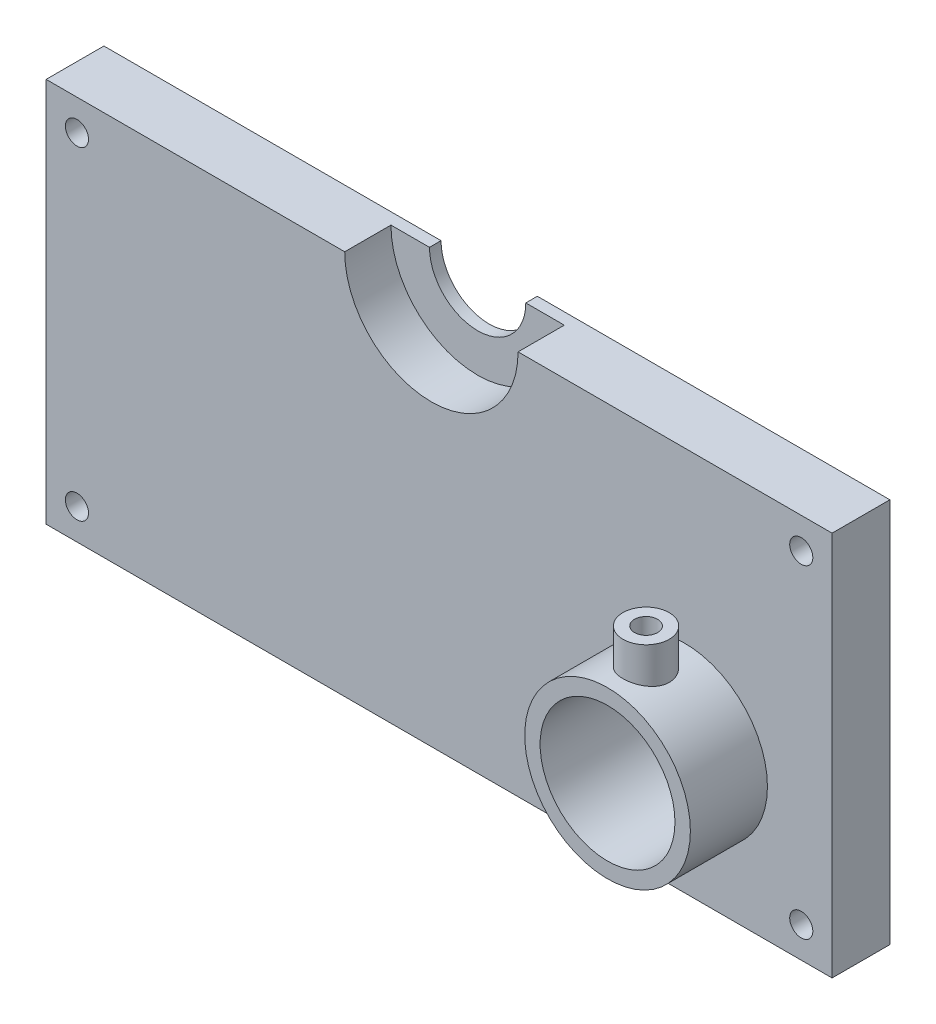
ISO-10303-21;
HEADER;
FILE_DESCRIPTION(('STEP AP214'),'2;1');
FILE_NAME('part.step','',(''),(''),'','','');
FILE_SCHEMA(('AUTOMOTIVE_DESIGN { 1 0 10303 214 1 1 1 1 }'));
ENDSEC;
DATA;
#1=APPLICATION_CONTEXT('core data for automotive mechanical design processes');
#2=APPLICATION_PROTOCOL_DEFINITION('international standard','automotive_design',2000,#1);
#3=PRODUCT_CONTEXT('',#1,'mechanical');
#4=PRODUCT('Part','Part','',(#3));
#5=PRODUCT_RELATED_PRODUCT_CATEGORY('part','',(#4));
#6=PRODUCT_DEFINITION_FORMATION('','',#4);
#7=PRODUCT_DEFINITION_CONTEXT('part definition',#1,'design');
#8=PRODUCT_DEFINITION('design','',#6,#7);
#9=PRODUCT_DEFINITION_SHAPE('','',#8);
#10=(LENGTH_UNIT() NAMED_UNIT(*) SI_UNIT(.MILLI.,.METRE.));
#11=(NAMED_UNIT(*) PLANE_ANGLE_UNIT() SI_UNIT($,.RADIAN.));
#12=(NAMED_UNIT(*) SI_UNIT($,.STERADIAN.) SOLID_ANGLE_UNIT());
#13=UNCERTAINTY_MEASURE_WITH_UNIT(LENGTH_MEASURE(1.E-05),#10,'distance_accuracy_value','');
#14=(GEOMETRIC_REPRESENTATION_CONTEXT(3) GLOBAL_UNCERTAINTY_ASSIGNED_CONTEXT((#13)) GLOBAL_UNIT_ASSIGNED_CONTEXT((#10,
#11,#12)) REPRESENTATION_CONTEXT('',''));
#15=CARTESIAN_POINT('',(0.,0.,0.));
#16=DIRECTION('',(0.,0.,1.));
#17=DIRECTION('',(1.,0.,0.));
#18=AXIS2_PLACEMENT_3D('',#15,#16,#17);
#19=CARTESIAN_POINT('',(-46.,-4.,115.5));
#20=DIRECTION('',(0.,0.,-1.));
#21=DIRECTION('',(-1.,0.,0.));
#22=AXIS2_PLACEMENT_3D('',#19,#20,#21);
#23=CYLINDRICAL_SURFACE('',#22,1.5);
#24=CARTESIAN_POINT('',(-46.,-4.,113.));
#25=DIRECTION('',(0.,0.,1.));
#26=DIRECTION('',(1.,0.,0.));
#27=AXIS2_PLACEMENT_3D('',#24,#25,#26);
#28=CIRCLE('',#27,1.5);
#29=CARTESIAN_POINT('',(-44.5,-4.,113.));
#30=VERTEX_POINT('',#29);
#31=EDGE_CURVE('E538',#30,#30,#28,.T.);
#32=ORIENTED_EDGE('',*,*,#31,.T.);
#33=EDGE_LOOP('',(#32));
#34=FACE_BOUND('',#33,.T.);
#35=CARTESIAN_POINT('',(-46.,-4.,107.5));
#36=DIRECTION('',(0.,0.,-1.));
#37=DIRECTION('',(-1.,0.,0.));
#38=AXIS2_PLACEMENT_3D('',#35,#36,#37);
#39=CIRCLE('',#38,1.5);
#40=CARTESIAN_POINT('',(-47.5,-4.,107.5));
#41=VERTEX_POINT('',#40);
#42=EDGE_CURVE('E39',#41,#41,#39,.F.);
#43=ORIENTED_EDGE('',*,*,#42,.F.);
#44=EDGE_LOOP('',(#43));
#45=FACE_BOUND('',#44,.T.);
#46=ADVANCED_FACE('F35',(#34,#45),#23,.F.);
#47=CARTESIAN_POINT('',(-46.,-46.,115.5));
#48=DIRECTION('',(0.,0.,-1.));
#49=DIRECTION('',(-1.,0.,0.));
#50=AXIS2_PLACEMENT_3D('',#47,#48,#49);
#51=CYLINDRICAL_SURFACE('',#50,1.5);
#52=CARTESIAN_POINT('',(-46.,-46.,113.));
#53=DIRECTION('',(0.,0.,1.));
#54=DIRECTION('',(1.,0.,0.));
#55=AXIS2_PLACEMENT_3D('',#52,#53,#54);
#56=CIRCLE('',#55,1.5);
#57=CARTESIAN_POINT('',(-44.5,-46.,113.));
#58=VERTEX_POINT('',#57);
#59=EDGE_CURVE('E299',#58,#58,#56,.T.);
#60=ORIENTED_EDGE('',*,*,#59,.T.);
#61=EDGE_LOOP('',(#60));
#62=FACE_BOUND('',#61,.T.);
#63=CARTESIAN_POINT('',(-46.,-46.,107.5));
#64=DIRECTION('',(0.,0.,-1.));
#65=DIRECTION('',(-1.,0.,0.));
#66=AXIS2_PLACEMENT_3D('',#63,#64,#65);
#67=CIRCLE('',#66,1.5);
#68=CARTESIAN_POINT('',(-47.5,-46.,107.5));
#69=VERTEX_POINT('',#68);
#70=EDGE_CURVE('E553',#69,#69,#67,.F.);
#71=ORIENTED_EDGE('',*,*,#70,.F.);
#72=EDGE_LOOP('',(#71));
#73=FACE_BOUND('',#72,.T.);
#74=ADVANCED_FACE('F250',(#62,#73),#51,.F.);
#75=CARTESIAN_POINT('',(48.,-46.,115.5));
#76=DIRECTION('',(0.,0.,-1.));
#77=DIRECTION('',(-1.,0.,0.));
#78=AXIS2_PLACEMENT_3D('',#75,#76,#77);
#79=CYLINDRICAL_SURFACE('',#78,1.5);
#80=CARTESIAN_POINT('',(48.,-46.,113.));
#81=DIRECTION('',(0.,0.,1.));
#82=DIRECTION('',(1.,0.,0.));
#83=AXIS2_PLACEMENT_3D('',#80,#81,#82);
#84=CIRCLE('',#83,1.5);
#85=CARTESIAN_POINT('',(49.5,-46.,113.));
#86=VERTEX_POINT('',#85);
#87=EDGE_CURVE('E542',#86,#86,#84,.T.);
#88=ORIENTED_EDGE('',*,*,#87,.T.);
#89=EDGE_LOOP('',(#88));
#90=FACE_BOUND('',#89,.T.);
#91=CARTESIAN_POINT('',(48.,-46.,107.5));
#92=DIRECTION('',(0.,0.,-1.));
#93=DIRECTION('',(-1.,0.,0.));
#94=AXIS2_PLACEMENT_3D('',#91,#92,#93);
#95=CIRCLE('',#94,1.5);
#96=CARTESIAN_POINT('',(46.5,-46.,107.5));
#97=VERTEX_POINT('',#96);
#98=EDGE_CURVE('E546',#97,#97,#95,.F.);
#99=ORIENTED_EDGE('',*,*,#98,.F.);
#100=EDGE_LOOP('',(#99));
#101=FACE_BOUND('',#100,.T.);
#102=ADVANCED_FACE('F257',(#90,#101),#79,.F.);
#103=CARTESIAN_POINT('',(48.,-4.,117.242640687119));
#104=DIRECTION('',(0.,0.,-1.));
#105=DIRECTION('',(-1.,0.,0.));
#106=AXIS2_PLACEMENT_3D('',#103,#104,#105);
#107=CYLINDRICAL_SURFACE('',#106,1.5);
#108=CARTESIAN_POINT('',(48.,-4.,113.));
#109=DIRECTION('',(0.,0.,1.));
#110=DIRECTION('',(1.,0.,0.));
#111=AXIS2_PLACEMENT_3D('',#108,#109,#110);
#112=CIRCLE('',#111,1.5);
#113=CARTESIAN_POINT('',(49.5,-4.,113.));
#114=VERTEX_POINT('',#113);
#115=EDGE_CURVE('E287',#114,#114,#112,.F.);
#116=ORIENTED_EDGE('',*,*,#115,.F.);
#117=EDGE_LOOP('',(#116));
#118=FACE_BOUND('',#117,.T.);
#119=CARTESIAN_POINT('',(48.,-4.,107.5));
#120=DIRECTION('',(0.,0.,-1.));
#121=DIRECTION('',(-1.,0.,0.));
#122=AXIS2_PLACEMENT_3D('',#119,#120,#121);
#123=CIRCLE('',#122,1.5);
#124=CARTESIAN_POINT('',(46.5,-4.,107.5));
#125=VERTEX_POINT('',#124);
#126=EDGE_CURVE('E186',#125,#125,#123,.F.);
#127=ORIENTED_EDGE('',*,*,#126,.F.);
#128=EDGE_LOOP('',(#127));
#129=FACE_BOUND('',#128,.T.);
#130=ADVANCED_FACE('F267',(#118,#129),#107,.F.);
#131=CARTESIAN_POINT('',(32.86,-32.68,123.));
#132=DIRECTION('',(0.,0.,-1.));
#133=DIRECTION('',(-1.,0.,0.));
#134=AXIS2_PLACEMENT_3D('',#131,#132,#133);
#135=CYLINDRICAL_SURFACE('',#134,10.75);
#136=CARTESIAN_POINT('',(32.86,-32.68,113.));
#137=DIRECTION('',(0.,0.,1.));
#138=DIRECTION('',(1.,0.,0.));
#139=AXIS2_PLACEMENT_3D('',#136,#137,#138);
#140=CIRCLE('',#139,10.75);
#141=CARTESIAN_POINT('',(43.61,-32.68,113.));
#142=VERTEX_POINT('',#141);
#143=EDGE_CURVE('E153',#142,#142,#140,.T.);
#144=ORIENTED_EDGE('',*,*,#143,.T.);
#145=EDGE_LOOP('',(#144));
#146=FACE_BOUND('',#145,.T.);
#147=CARTESIAN_POINT('',(32.86,-32.68,123.));
#148=DIRECTION('',(0.,0.,1.));
#149=DIRECTION('',(1.,0.,0.));
#150=AXIS2_PLACEMENT_3D('',#147,#148,#149);
#151=CIRCLE('',#150,10.75);
#152=CARTESIAN_POINT('',(43.61,-32.68,123.));
#153=VERTEX_POINT('',#152);
#154=EDGE_CURVE('E154',#153,#153,#151,.T.);
#155=ORIENTED_EDGE('',*,*,#154,.F.);
#156=EDGE_LOOP('',(#155));
#157=FACE_BOUND('',#156,.T.);
#158=CARTESIAN_POINT('',(32.86,-21.93,115.));
#159=CARTESIAN_POINT('',(32.6949077076346,-21.9300021699373,115.000003288464));
#160=CARTESIAN_POINT('',(32.5297811544795,-21.9338401379829,115.013673262241));
#161=CARTESIAN_POINT('',(32.2043036674773,-21.9487770769157,115.06788342221));
#162=CARTESIAN_POINT('',(32.0439547436764,-21.9598790600518,115.108434755682));
#163=CARTESIAN_POINT('',(31.7327762723217,-21.9881218354101,115.214972454814));
#164=CARTESIAN_POINT('',(31.5819341270789,-22.0052544291121,115.280924300282));
#165=CARTESIAN_POINT('',(31.2934504766978,-22.04375865675,115.436257962016));
#166=CARTESIAN_POINT('',(31.155810179185,-22.0651306779356,115.525641918924));
#167=CARTESIAN_POINT('',(30.8941700979436,-22.1104183025175,115.727678304179));
#168=CARTESIAN_POINT('',(30.7705501602774,-22.1343805755824,115.840812174128));
#169=CARTESIAN_POINT('',(30.5437684778834,-22.1818561737601,116.086108924169));
#170=CARTESIAN_POINT('',(30.4406096411602,-22.2053694346291,116.218274504516));
#171=CARTESIAN_POINT('',(30.2557742195686,-22.2497678486268,116.50098004966));
#172=CARTESIAN_POINT('',(30.1745441424239,-22.2705944262695,116.651821996239));
#173=CARTESIAN_POINT('',(30.0387517034795,-22.3065710848422,116.965698336376));
#174=CARTESIAN_POINT('',(29.9841838996154,-22.3217223240241,117.128730233991));
#175=CARTESIAN_POINT('',(29.9046023942352,-22.3441493559096,117.458129807144));
#176=CARTESIAN_POINT('',(29.8788957179174,-22.3516094413276,117.624317198873));
#177=CARTESIAN_POINT('',(29.8556043817253,-22.3583593011281,117.958800386303));
#178=CARTESIAN_POINT('',(29.858013920035,-22.357650761117,118.127095739863));
#179=CARTESIAN_POINT('',(29.8903385839298,-22.3483077982643,118.455529374855));
#180=CARTESIAN_POINT('',(29.9194048122015,-22.3399180032174,118.61575928713));
#181=CARTESIAN_POINT('',(30.0028538788318,-22.3165509991549,118.928972312695));
#182=CARTESIAN_POINT('',(30.0572389115411,-22.3015732191726,119.081954796591));
#183=CARTESIAN_POINT('',(30.190449258091,-22.2665100029562,119.378493787044));
#184=CARTESIAN_POINT('',(30.2695640809612,-22.2463645990934,119.521912849871));
#185=CARTESIAN_POINT('',(30.4497865778065,-22.2032670119221,119.793732814414));
#186=CARTESIAN_POINT('',(30.5508989483605,-22.1803142296842,119.922130499979));
#187=CARTESIAN_POINT('',(30.7765421898665,-22.1331791462612,120.165100878993));
#188=CARTESIAN_POINT('',(30.9017830143566,-22.1089822753319,120.279012425079));
#189=CARTESIAN_POINT('',(31.1698884810187,-22.062820559194,120.484358138123));
#190=CARTESIAN_POINT('',(31.3127539544975,-22.0408558193581,120.575791244223));
#191=CARTESIAN_POINT('',(31.6131406892037,-22.0014760261901,120.733914577847));
#192=CARTESIAN_POINT('',(31.770733360272,-21.9840848855177,120.800475496542));
#193=CARTESIAN_POINT('',(32.0954702101624,-21.9559842363693,120.905962867771));
#194=CARTESIAN_POINT('',(32.2626120856294,-21.9452731239753,120.944895954236));
#195=CARTESIAN_POINT('',(32.5960683674122,-21.9319859730551,120.992962016185));
#196=CARTESIAN_POINT('',(32.7622437921323,-21.9291649236079,121.002992806441));
#197=CARTESIAN_POINT('',(33.0939059549557,-21.9312661679615,120.99546226531));
#198=CARTESIAN_POINT('',(33.2593927694226,-21.9361875789029,120.977904079847));
#199=CARTESIAN_POINT('',(33.5817095168757,-21.9530616591184,120.916427031289));
#200=CARTESIAN_POINT('',(33.7386443776467,-21.9648783823179,120.873017514593));
#201=CARTESIAN_POINT('',(34.0429826825683,-21.9941942108344,120.761669155185));
#202=CARTESIAN_POINT('',(34.1903850449962,-22.0116939596939,120.693727534374));
#203=CARTESIAN_POINT('',(34.4748966016214,-22.0509980954043,120.533635812785));
#204=CARTESIAN_POINT('',(34.6117256599771,-22.0728849400784,120.441008625233));
#205=CARTESIAN_POINT('',(34.8682102946067,-22.1184381614209,120.234767419694));
#206=CARTESIAN_POINT('',(34.9878621362302,-22.1421049233775,120.121148850029));
#207=CARTESIAN_POINT('',(35.2104420064211,-22.189466567328,119.871947409586));
#208=CARTESIAN_POINT('',(35.3127342805641,-22.2131394381821,119.735791394227));
#209=CARTESIAN_POINT('',(35.4930435759736,-22.2570337649726,119.44773865815));
#210=CARTESIAN_POINT('',(35.5710615134387,-22.2772553511597,119.295842531808));
#211=CARTESIAN_POINT('',(35.7000288609959,-22.3117216729352,118.981304072504));
#212=CARTESIAN_POINT('',(35.7511275241932,-22.3259992702017,118.818726736885));
#213=CARTESIAN_POINT('',(35.8251137801148,-22.3469410603042,118.486814452));
#214=CARTESIAN_POINT('',(35.8480094348124,-22.3536074288089,118.317481448173));
#215=CARTESIAN_POINT('',(35.8644444378075,-22.3583782052036,117.983406454627));
#216=CARTESIAN_POINT('',(35.8590105355481,-22.3567820859822,117.818718532958));
#217=CARTESIAN_POINT('',(35.8213472595891,-22.3459156953241,117.492706885734));
#218=CARTESIAN_POINT('',(35.789118704489,-22.3366456583322,117.331383057556));
#219=CARTESIAN_POINT('',(35.6994016566621,-22.3116626307215,117.018109457898));
#220=CARTESIAN_POINT('',(35.6421502439351,-22.2960102014831,116.866086614696));
#221=CARTESIAN_POINT('',(35.5041959822787,-22.2600294388204,116.573685536655));
#222=CARTESIAN_POINT('',(35.4234891451384,-22.2397003103224,116.433309287351));
#223=CARTESIAN_POINT('',(35.2378858722936,-22.195844611131,116.163333621451));
#224=CARTESIAN_POINT('',(35.1322982064268,-22.1722365585735,116.034222608134));
#225=CARTESIAN_POINT('',(34.9012196827484,-22.1249154999014,115.795218265906));
#226=CARTESIAN_POINT('',(34.7757238853476,-22.1012024691628,115.685329720724));
#227=CARTESIAN_POINT('',(34.5047434277993,-22.0556590374746,115.485271933957));
#228=CARTESIAN_POINT('',(34.3588498831592,-22.0338877898094,115.395641827534));
#229=CARTESIAN_POINT('',(34.0534590153392,-21.9953486774041,115.242318184571));
#230=CARTESIAN_POINT('',(33.8939696594222,-21.9785779079083,115.178609582471));
#231=CARTESIAN_POINT('',(33.5894511307504,-21.9538489869529,115.086328003598));
#232=CARTESIAN_POINT('',(33.4456135076415,-21.9449738399838,115.05403451896));
#233=CARTESIAN_POINT('',(33.1545260693715,-21.933048729449,115.010870340576));
#234=CARTESIAN_POINT('',(33.0072766673794,-21.9299980642274,114.999997066405));
#235=CARTESIAN_POINT('',(32.86,-21.93,115.));
#236=B_SPLINE_CURVE_WITH_KNOTS('',3,(#158,#159,#160,#161,#162,#163,#164,#165,#166,#167,#168,
#169,#170,#171,#172,#173,#174,#175,#176,#177,#178,#179,#180,#181,#182,#183,#184,#185,#186,#187,
#188,#189,#190,#191,#192,#193,#194,#195,#196,#197,#198,#199,#200,#201,#202,#203,#204,#205,#206,
#207,#208,#209,#210,#211,#212,#213,#214,#215,#216,#217,#218,#219,#220,#221,#222,#223,#224,#225,
#226,#227,#228,#229,#230,#231,#232,#233,#234,#235),.UNSPECIFIED.,.T.,.F.,(4,2,2,2,2,2,2,2,2,2,2,
2,2,2,2,2,2,2,2,2,2,2,2,2,2,2,2,2,2,2,2,2,2,2,2,2,2,2,4),(0.,0.494736463878208,
0.989678215694691,1.48394968432605,1.97826632289823,2.48378609334166,2.98937765865483,
3.50459744507509,4.01971202547277,4.52217460592408,5.02453350442823,5.5114299319151,
5.9983685659962,6.49123589142707,6.98420854977923,7.49486501747537,8.005545580661,
8.51884537088074,9.03202186699993,9.52907565836441,10.026072775643,10.5135873226137,
11.001157094719,11.4989354935255,11.9968219553539,12.5101909427328,13.023540551411,
13.5340131290523,14.0443397516234,14.5363020717037,15.0282493624667,15.5156334312274,
16.0031004202002,16.5061614028528,17.0093474003749,17.5246617006683,18.039676071343,
18.4810771554106,18.9224250620093),.UNSPECIFIED.);
#237=CARTESIAN_POINT('',(32.86,-21.93,115.));
#238=VERTEX_POINT('',#237);
#239=EDGE_CURVE('E11',#238,#238,#236,.T.);
#240=ORIENTED_EDGE('',*,*,#239,.F.);
#241=EDGE_LOOP('',(#240));
#242=FACE_BOUND('',#241,.T.);
#243=ADVANCED_FACE('F188',(#146,#157,#242),#135,.T.);
#244=CARTESIAN_POINT('',(0.,0.,113.));
#245=DIRECTION('',(0.,0.,1.));
#246=DIRECTION('',(1.,0.,0.));
#247=AXIS2_PLACEMENT_3D('',#244,#245,#246);
#248=PLANE('',#247);
#249=ORIENTED_EDGE('',*,*,#31,.F.);
#250=EDGE_LOOP('',(#249));
#251=FACE_BOUND('',#250,.T.);
#252=ORIENTED_EDGE('',*,*,#87,.F.);
#253=EDGE_LOOP('',(#252));
#254=FACE_BOUND('',#253,.T.);
#255=ORIENTED_EDGE('',*,*,#59,.F.);
#256=EDGE_LOOP('',(#255));
#257=FACE_BOUND('',#256,.T.);
#258=ORIENTED_EDGE('',*,*,#115,.T.);
#259=EDGE_LOOP('',(#258));
#260=FACE_BOUND('',#259,.T.);
#261=DIRECTION('',(0.,-1.,0.));
#262=VECTOR('',#261,1.);
#263=CARTESIAN_POINT('',(52.,0.,113.));
#264=LINE('',#263,#262);
#265=CARTESIAN_POINT('',(52.,0.,113.));
#266=VERTEX_POINT('',#265);
#267=CARTESIAN_POINT('',(52.,-50.,113.));
#268=VERTEX_POINT('',#267);
#269=EDGE_CURVE('E117',#266,#268,#264,.T.);
#270=ORIENTED_EDGE('',*,*,#269,.F.);
#271=DIRECTION('',(-1.,0.,0.));
#272=VECTOR('',#271,1.);
#273=CARTESIAN_POINT('',(70.,0.,113.));
#274=LINE('',#273,#272);
#275=CARTESIAN_POINT('',(11.25,0.,113.));
#276=VERTEX_POINT('',#275);
#277=EDGE_CURVE('E116',#266,#276,#274,.T.);
#278=ORIENTED_EDGE('',*,*,#277,.T.);
#279=CARTESIAN_POINT('',(0.,0.,113.));
#280=DIRECTION('',(0.,0.,-1.));
#281=DIRECTION('',(1.,0.,0.));
#282=AXIS2_PLACEMENT_3D('',#279,#280,#281);
#283=CIRCLE('',#282,11.25);
#284=CARTESIAN_POINT('',(-11.25,0.,113.));
#285=VERTEX_POINT('',#284);
#286=EDGE_CURVE('E44',#276,#285,#283,.T.);
#287=ORIENTED_EDGE('',*,*,#286,.T.);
#288=DIRECTION('',(-1.,0.,0.));
#289=VECTOR('',#288,1.);
#290=CARTESIAN_POINT('',(-11.25,0.,113.));
#291=LINE('',#290,#289);
#292=CARTESIAN_POINT('',(-50.,0.,113.));
#293=VERTEX_POINT('',#292);
#294=EDGE_CURVE('E170',#285,#293,#291,.T.);
#295=ORIENTED_EDGE('',*,*,#294,.T.);
#296=DIRECTION('',(0.,-1.,0.));
#297=VECTOR('',#296,1.);
#298=CARTESIAN_POINT('',(-50.,0.,113.));
#299=LINE('',#298,#297);
#300=CARTESIAN_POINT('',(-50.,-50.,113.));
#301=VERTEX_POINT('',#300);
#302=EDGE_CURVE('E167',#293,#301,#299,.T.);
#303=ORIENTED_EDGE('',*,*,#302,.T.);
#304=DIRECTION('',(1.,0.,0.));
#305=VECTOR('',#304,1.);
#306=CARTESIAN_POINT('',(-50.,-50.,113.));
#307=LINE('',#306,#305);
#308=EDGE_CURVE('E164',#301,#268,#307,.T.);
#309=ORIENTED_EDGE('',*,*,#308,.T.);
#310=EDGE_LOOP('',(#270,#278,#287,#295,#303,#309));
#311=FACE_BOUND('',#310,.T.);
#312=ORIENTED_EDGE('',*,*,#143,.F.);
#313=EDGE_LOOP('',(#312));
#314=FACE_BOUND('',#313,.T.);
#315=ADVANCED_FACE('F234',(#251,#254,#257,#260,#311,#314),#248,.T.);
#316=CARTESIAN_POINT('',(0.,-50.,110.));
#317=DIRECTION('',(0.,1.,0.));
#318=DIRECTION('',(0.,0.,1.));
#319=AXIS2_PLACEMENT_3D('',#316,#317,#318);
#320=PLANE('',#319);
#321=DIRECTION('',(-1.,0.,0.));
#322=VECTOR('',#321,1.);
#323=CARTESIAN_POINT('',(70.,-50.,105.5));
#324=LINE('',#323,#322);
#325=CARTESIAN_POINT('',(52.,-50.,105.5));
#326=VERTEX_POINT('',#325);
#327=CARTESIAN_POINT('',(-50.,-50.,105.5));
#328=VERTEX_POINT('',#327);
#329=EDGE_CURVE('E140',#326,#328,#324,.T.);
#330=ORIENTED_EDGE('',*,*,#329,.F.);
#331=DIRECTION('',(0.,0.,-1.));
#332=VECTOR('',#331,1.);
#333=CARTESIAN_POINT('',(52.,-50.,145.));
#334=LINE('',#333,#332);
#335=EDGE_CURVE('E52',#268,#326,#334,.T.);
#336=ORIENTED_EDGE('',*,*,#335,.F.);
#337=ORIENTED_EDGE('',*,*,#308,.F.);
#338=DIRECTION('',(0.,0.,-1.));
#339=VECTOR('',#338,1.);
#340=CARTESIAN_POINT('',(-50.,-50.,110.));
#341=LINE('',#340,#339);
#342=EDGE_CURVE('E178',#301,#328,#341,.T.);
#343=ORIENTED_EDGE('',*,*,#342,.T.);
#344=EDGE_LOOP('',(#330,#336,#337,#343));
#345=FACE_BOUND('',#344,.T.);
#346=ADVANCED_FACE('F238',(#345),#320,.F.);
#347=CARTESIAN_POINT('',(0.,0.,110.));
#348=DIRECTION('',(0.,0.,-1.));
#349=DIRECTION('',(-1.,0.,0.));
#350=AXIS2_PLACEMENT_3D('',#347,#348,#349);
#351=CYLINDRICAL_SURFACE('',#350,11.25);
#352=CARTESIAN_POINT('',(0.,0.,107.));
#353=DIRECTION('',(0.,0.,1.));
#354=DIRECTION('',(1.,0.,0.));
#355=AXIS2_PLACEMENT_3D('',#352,#353,#354);
#356=CIRCLE('',#355,11.25);
#357=CARTESIAN_POINT('',(-11.25,0.,107.));
#358=VERTEX_POINT('',#357);
#359=CARTESIAN_POINT('',(11.25,0.,107.));
#360=VERTEX_POINT('',#359);
#361=EDGE_CURVE('E159',#358,#360,#356,.T.);
#362=ORIENTED_EDGE('',*,*,#361,.F.);
#363=DIRECTION('',(0.,0.,-1.));
#364=VECTOR('',#363,1.);
#365=CARTESIAN_POINT('',(-11.25,0.,110.));
#366=LINE('',#365,#364);
#367=EDGE_CURVE('E60',#285,#358,#366,.T.);
#368=ORIENTED_EDGE('',*,*,#367,.F.);
#369=ORIENTED_EDGE('',*,*,#286,.F.);
#370=DIRECTION('',(0.,0.,-1.));
#371=VECTOR('',#370,1.);
#372=CARTESIAN_POINT('',(11.25,0.,110.));
#373=LINE('',#372,#371);
#374=EDGE_CURVE('E162',#276,#360,#373,.T.);
#375=ORIENTED_EDGE('',*,*,#374,.T.);
#376=EDGE_LOOP('',(#362,#368,#369,#375));
#377=FACE_BOUND('',#376,.T.);
#378=ADVANCED_FACE('F231',(#377),#351,.F.);
#379=CARTESIAN_POINT('',(-50.,0.,110.));
#380=DIRECTION('',(1.,0.,0.));
#381=DIRECTION('',(0.,1.,0.));
#382=AXIS2_PLACEMENT_3D('',#379,#380,#381);
#383=PLANE('',#382);
#384=DIRECTION('',(0.,0.,-1.));
#385=VECTOR('',#384,1.);
#386=CARTESIAN_POINT('',(-50.,0.,110.));
#387=LINE('',#386,#385);
#388=CARTESIAN_POINT('',(-50.,0.,105.5));
#389=VERTEX_POINT('',#388);
#390=EDGE_CURVE('E176',#293,#389,#387,.T.);
#391=ORIENTED_EDGE('',*,*,#390,.T.);
#392=DIRECTION('',(0.,1.,0.));
#393=VECTOR('',#392,1.);
#394=CARTESIAN_POINT('',(-50.,-50.,105.5));
#395=LINE('',#394,#393);
#396=EDGE_CURVE('E218',#328,#389,#395,.T.);
#397=ORIENTED_EDGE('',*,*,#396,.F.);
#398=ORIENTED_EDGE('',*,*,#342,.F.);
#399=ORIENTED_EDGE('',*,*,#302,.F.);
#400=EDGE_LOOP('',(#391,#397,#398,#399));
#401=FACE_BOUND('',#400,.T.);
#402=ADVANCED_FACE('F240',(#401),#383,.F.);
#403=CARTESIAN_POINT('',(0.,0.,110.));
#404=DIRECTION('',(0.,1.,0.));
#405=DIRECTION('',(0.,0.,1.));
#406=AXIS2_PLACEMENT_3D('',#403,#404,#405);
#407=PLANE('',#406);
#408=ORIENTED_EDGE('',*,*,#367,.T.);
#409=DIRECTION('',(1.,0.,0.));
#410=VECTOR('',#409,1.);
#411=CARTESIAN_POINT('',(-6.25,0.,107.));
#412=LINE('',#411,#410);
#413=CARTESIAN_POINT('',(-6.25,0.,107.));
#414=VERTEX_POINT('',#413);
#415=EDGE_CURVE('E132',#358,#414,#412,.T.);
#416=ORIENTED_EDGE('',*,*,#415,.T.);
#417=DIRECTION('',(0.,0.,1.));
#418=VECTOR('',#417,1.);
#419=CARTESIAN_POINT('',(-6.25,0.,105.5));
#420=LINE('',#419,#418);
#421=CARTESIAN_POINT('',(-6.25,0.,105.5));
#422=VERTEX_POINT('',#421);
#423=EDGE_CURVE('E126',#422,#414,#420,.T.);
#424=ORIENTED_EDGE('',*,*,#423,.F.);
#425=DIRECTION('',(1.,0.,0.));
#426=VECTOR('',#425,1.);
#427=CARTESIAN_POINT('',(-50.,0.,105.5));
#428=LINE('',#427,#426);
#429=EDGE_CURVE('E128',#389,#422,#428,.T.);
#430=ORIENTED_EDGE('',*,*,#429,.F.);
#431=ORIENTED_EDGE('',*,*,#390,.F.);
#432=ORIENTED_EDGE('',*,*,#294,.F.);
#433=EDGE_LOOP('',(#408,#416,#424,#430,#431,#432));
#434=FACE_BOUND('',#433,.T.);
#435=ADVANCED_FACE('F224',(#434),#407,.T.);
#436=DIRECTION('',(0.,0.,-1.));
#437=VECTOR('',#436,1.);
#438=CARTESIAN_POINT('',(52.,0.,145.));
#439=LINE('',#438,#437);
#440=CARTESIAN_POINT('',(52.,0.,105.5));
#441=VERTEX_POINT('',#440);
#442=EDGE_CURVE('E103',#266,#441,#439,.T.);
#443=ORIENTED_EDGE('',*,*,#442,.T.);
#444=DIRECTION('',(1.,0.,0.));
#445=VECTOR('',#444,1.);
#446=CARTESIAN_POINT('',(11.25,0.,105.5));
#447=LINE('',#446,#445);
#448=CARTESIAN_POINT('',(6.25,0.,105.5));
#449=VERTEX_POINT('',#448);
#450=EDGE_CURVE('E114',#449,#441,#447,.T.);
#451=ORIENTED_EDGE('',*,*,#450,.F.);
#452=DIRECTION('',(0.,0.,1.));
#453=VECTOR('',#452,1.);
#454=CARTESIAN_POINT('',(6.25,0.,105.5));
#455=LINE('',#454,#453);
#456=CARTESIAN_POINT('',(6.25,0.,107.));
#457=VERTEX_POINT('',#456);
#458=EDGE_CURVE('E124',#449,#457,#455,.T.);
#459=ORIENTED_EDGE('',*,*,#458,.T.);
#460=DIRECTION('',(1.,0.,0.));
#461=VECTOR('',#460,1.);
#462=CARTESIAN_POINT('',(11.25,0.,107.));
#463=LINE('',#462,#461);
#464=EDGE_CURVE('E138',#457,#360,#463,.T.);
#465=ORIENTED_EDGE('',*,*,#464,.T.);
#466=ORIENTED_EDGE('',*,*,#374,.F.);
#467=ORIENTED_EDGE('',*,*,#277,.F.);
#468=EDGE_LOOP('',(#443,#451,#459,#465,#466,#467));
#469=FACE_BOUND('',#468,.T.);
#470=ADVANCED_FACE('F37',(#469),#407,.T.);
#471=CARTESIAN_POINT('',(32.86,-32.68,103.));
#472=DIRECTION('',(0.,0.,1.));
#473=DIRECTION('',(1.,0.,0.));
#474=AXIS2_PLACEMENT_3D('',#471,#472,#473);
#475=CYLINDRICAL_SURFACE('',#474,8.75);
#476=CARTESIAN_POINT('',(32.86,-23.93,119.5));
#477=CARTESIAN_POINT('',(32.7764010557614,-23.9300014546683,119.499996680014));
#478=CARTESIAN_POINT('',(32.6927573709285,-23.9312105329208,119.492987605443));
#479=CARTESIAN_POINT('',(32.5278183721145,-23.9359173346064,119.465149549782));
#480=CARTESIAN_POINT('',(32.4465252480789,-23.9394171247638,119.44430808861));
#481=CARTESIAN_POINT('',(32.2886973549334,-23.9483130318723,119.389455043024));
#482=CARTESIAN_POINT('',(32.212158666287,-23.9537075617203,119.355454478734));
#483=CARTESIAN_POINT('',(32.0658816313764,-23.9658006959179,119.275277779883));
#484=CARTESIAN_POINT('',(31.9961425586006,-23.9724991607178,119.22910294805));
#485=CARTESIAN_POINT('',(31.8647315600924,-23.9865338709729,119.125393073581));
#486=CARTESIAN_POINT('',(31.8031381920434,-23.9938753307604,119.067759185435));
#487=CARTESIAN_POINT('',(31.6904458255879,-24.0083289601225,118.942979950685));
#488=CARTESIAN_POINT('',(31.6393475087641,-24.0154411147798,118.875833986814));
#489=CARTESIAN_POINT('',(31.5487782828616,-24.0286813971236,118.733393555312));
#490=CARTESIAN_POINT('',(31.5093855478369,-24.0348027898712,118.658048700781));
#491=CARTESIAN_POINT('',(31.4438457244203,-24.0452958557686,118.501688686464));
#492=CARTESIAN_POINT('',(31.4176976878805,-24.049667654162,118.420673933041));
#493=CARTESIAN_POINT('',(31.3796380421934,-24.0561144984044,118.256108341748));
#494=CARTESIAN_POINT('',(31.3675904976282,-24.0582114601215,118.172589817079));
#495=CARTESIAN_POINT('',(31.3576522494172,-24.059937449697,118.004692432541));
#496=CARTESIAN_POINT('',(31.359760485832,-24.0595666623326,117.920313637558));
#497=CARTESIAN_POINT('',(31.3779633401448,-24.0564190456365,117.754064430078));
#498=CARTESIAN_POINT('',(31.3939048487148,-24.0536685562857,117.672176681911));
#499=CARTESIAN_POINT('',(31.439081261067,-24.0461127078678,117.512255541786));
#500=CARTESIAN_POINT('',(31.4683166448109,-24.0413072746095,117.434222289104));
#501=CARTESIAN_POINT('',(31.5394049446507,-24.0301547366039,117.283769128377));
#502=CARTESIAN_POINT('',(31.5813210544811,-24.0237999422147,117.211379672488));
#503=CARTESIAN_POINT('',(31.6765361342214,-24.0102699880903,117.074603764877));
#504=CARTESIAN_POINT('',(31.7298360748074,-24.0030947584226,117.010217996355));
#505=CARTESIAN_POINT('',(31.847138138502,-23.9886168728747,116.890391222025));
#506=CARTESIAN_POINT('',(31.911271540364,-23.981313780534,116.835078701229));
#507=CARTESIAN_POINT('',(32.0479770575203,-23.9674899796245,116.735980274384));
#508=CARTESIAN_POINT('',(32.1205492331915,-23.9609692766542,116.692194450812));
#509=CARTESIAN_POINT('',(32.2721959329807,-23.9494348942743,116.617379075455));
#510=CARTESIAN_POINT('',(32.3512763861181,-23.9444226088212,116.586361313197));
#511=CARTESIAN_POINT('',(32.5136295776022,-23.9364808987573,116.538084098662));
#512=CARTESIAN_POINT('',(32.596901943955,-23.9335512896757,116.520823427848));
#513=CARTESIAN_POINT('',(32.7641681895266,-23.9301299416305,116.500725557551));
#514=CARTESIAN_POINT('',(32.8481402959156,-23.9296084047716,116.497712050002));
#515=CARTESIAN_POINT('',(33.0153892952816,-23.9309801977988,116.505723374273));
#516=CARTESIAN_POINT('',(33.0986662164754,-23.9328734291879,116.516747633499));
#517=CARTESIAN_POINT('',(33.2616131339057,-23.9388435628619,116.552374916063));
#518=CARTESIAN_POINT('',(33.3413028687202,-23.9429063553335,116.576890230971));
#519=CARTESIAN_POINT('',(33.4954412654897,-23.9527619213896,116.638709916487));
#520=CARTESIAN_POINT('',(33.5698896188184,-23.958554796741,116.676015039435));
#521=CARTESIAN_POINT('',(33.7121948464523,-23.9713019829285,116.762756208437));
#522=CARTESIAN_POINT('',(33.7799839689103,-23.9782665956814,116.812301862841));
#523=CARTESIAN_POINT('',(33.9063487632021,-23.992554712087,116.921967441162));
#524=CARTESIAN_POINT('',(33.9649237238246,-23.9998782433864,116.982088180578));
#525=CARTESIAN_POINT('',(34.0718546145952,-24.0141556939664,117.111989744284));
#526=CARTESIAN_POINT('',(34.1200911520327,-24.0211046661724,117.181869479399));
#527=CARTESIAN_POINT('',(34.2041408859787,-24.0337522977592,117.328843613303));
#528=CARTESIAN_POINT('',(34.2399544924823,-24.0394509984004,117.405937773886));
#529=CARTESIAN_POINT('',(34.2979651953311,-24.0489153615182,117.564825240148));
#530=CARTESIAN_POINT('',(34.3202206875589,-24.0526893024745,117.646596709589));
#531=CARTESIAN_POINT('',(34.3506664365529,-24.057897223471,117.812787732904));
#532=CARTESIAN_POINT('',(34.3588579942961,-24.0593314199474,117.897207041105));
#533=CARTESIAN_POINT('',(34.3609054627889,-24.0596877718996,118.065104405695));
#534=CARTESIAN_POINT('',(34.3549493819675,-24.0586428723774,118.14858015866));
#535=CARTESIAN_POINT('',(34.3292782907083,-24.0542311548902,118.313322758138));
#536=CARTESIAN_POINT('',(34.3095633324798,-24.0508643457359,118.39458961303));
#537=CARTESIAN_POINT('',(34.2570077771887,-24.0422009832273,118.552528609254));
#538=CARTESIAN_POINT('',(34.2241842846947,-24.0369069453956,118.629206589007));
#539=CARTESIAN_POINT('',(34.1463629586939,-24.024983350974,118.775997777157));
#540=CARTESIAN_POINT('',(34.1013644642831,-24.0183537218885,118.846110628897));
#541=CARTESIAN_POINT('',(33.9998032642721,-24.0044019620834,118.978729455133));
#542=CARTESIAN_POINT('',(33.9431025563192,-23.997072186725,119.041128957281));
#543=CARTESIAN_POINT('',(33.8200368561938,-23.9826061437142,119.155591630584));
#544=CARTESIAN_POINT('',(33.7536696401273,-23.9754699210401,119.207652416663));
#545=CARTESIAN_POINT('',(33.6125738391866,-23.9621340724088,119.300311461065));
#546=CARTESIAN_POINT('',(33.5377873832997,-23.9559417159926,119.3408226569));
#547=CARTESIAN_POINT('',(33.3823934338871,-23.9452620466973,119.408643841801));
#548=CARTESIAN_POINT('',(33.3017917565104,-23.9407730575595,119.435966816444));
#549=CARTESIAN_POINT('',(33.1607439653399,-23.9349715548913,119.470788433548));
#550=CARTESIAN_POINT('',(33.1011452484051,-23.9331173084994,119.481724974446));
#551=CARTESIAN_POINT('',(32.9810388282801,-23.9306310159357,119.49633189113));
#552=CARTESIAN_POINT('',(32.9205311422467,-23.9299989467243,119.500002403889));
#553=CARTESIAN_POINT('',(32.86,-23.93,119.5));
#554=B_SPLINE_CURVE_WITH_KNOTS('',3,(#476,#477,#478,#479,#480,#481,#482,#483,#484,#485,#486,
#487,#488,#489,#490,#491,#492,#493,#494,#495,#496,#497,#498,#499,#500,#501,#502,#503,#504,#505,
#506,#507,#508,#509,#510,#511,#512,#513,#514,#515,#516,#517,#518,#519,#520,#521,#522,#523,#524,
#525,#526,#527,#528,#529,#530,#531,#532,#533,#534,#535,#536,#537,#538,#539,#540,#541,#542,#543,
#544,#545,#546,#547,#548,#549,#550,#551,#552,#553),.UNSPECIFIED.,.T.,.F.,(4,2,2,2,2,2,2,2,2,2,2,
2,2,2,2,2,2,2,2,2,2,2,2,2,2,2,2,2,2,2,2,2,2,2,2,2,2,2,4),(0.,0.2505755508786,0.501377488035615,
0.751969843365159,1.00253539450022,1.25536421770617,1.50820945525043,1.76270717478228,
2.0171866730153,2.26919211577892,2.52117868939363,2.77041129544868,3.01965290050547,
3.27015764139126,3.5206837508373,3.7744978634585,4.02831379215348,4.28236356164808,
4.53639082616132,4.78726613745984,5.03813121601952,5.28738430760509,5.53665206361357,
5.78823838646019,6.03984411892219,6.29421523620441,6.54857795765347,6.80183722664439,
7.05507306675442,7.30496251367272,7.55485101236714,7.80441450581767,8.05399154921286,
8.30669980095777,8.55946628331322,8.81409060872389,9.06846370822284,9.24990033265445,
9.43133353676863),.UNSPECIFIED.);
#555=CARTESIAN_POINT('',(32.86,-23.93,119.5));
#556=VERTEX_POINT('',#555);
#557=EDGE_CURVE('E108',#556,#556,#554,.T.);
#558=ORIENTED_EDGE('',*,*,#557,.F.);
#559=EDGE_LOOP('',(#558));
#560=FACE_BOUND('',#559,.T.);
#561=CARTESIAN_POINT('',(32.86,-32.68,123.));
#562=DIRECTION('',(0.,0.,1.));
#563=DIRECTION('',(1.,0.,0.));
#564=AXIS2_PLACEMENT_3D('',#561,#562,#563);
#565=CIRCLE('',#564,8.75);
#566=CARTESIAN_POINT('',(41.61,-32.68,123.));
#567=VERTEX_POINT('',#566);
#568=EDGE_CURVE('E150',#567,#567,#565,.T.);
#569=ORIENTED_EDGE('',*,*,#568,.T.);
#570=EDGE_LOOP('',(#569));
#571=FACE_BOUND('',#570,.T.);
#572=CARTESIAN_POINT('',(32.86,-32.68,99.));
#573=DIRECTION('',(0.,0.,-1.));
#574=DIRECTION('',(-1.,0.,0.));
#575=AXIS2_PLACEMENT_3D('',#572,#573,#574);
#576=CIRCLE('',#575,8.75);
#577=CARTESIAN_POINT('',(24.11,-32.68,99.));
#578=VERTEX_POINT('',#577);
#579=EDGE_CURVE('E144',#578,#578,#576,.T.);
#580=ORIENTED_EDGE('',*,*,#579,.T.);
#581=EDGE_LOOP('',(#580));
#582=FACE_BOUND('',#581,.T.);
#583=ADVANCED_FACE('F432',(#560,#571,#582),#475,.F.);
#584=CARTESIAN_POINT('',(32.86,-32.68,123.));
#585=DIRECTION('',(0.,0.,1.));
#586=DIRECTION('',(1.,0.,0.));
#587=AXIS2_PLACEMENT_3D('',#584,#585,#586);
#588=PLANE('',#587);
#589=ORIENTED_EDGE('',*,*,#154,.T.);
#590=EDGE_LOOP('',(#589));
#591=FACE_BOUND('',#590,.T.);
#592=ORIENTED_EDGE('',*,*,#568,.F.);
#593=EDGE_LOOP('',(#592));
#594=FACE_BOUND('',#593,.T.);
#595=ADVANCED_FACE('F436',(#591,#594),#588,.T.);
#596=CARTESIAN_POINT('',(32.86,-32.68,99.));
#597=DIRECTION('',(0.,0.,-1.));
#598=DIRECTION('',(-1.,0.,0.));
#599=AXIS2_PLACEMENT_3D('',#596,#597,#598);
#600=PLANE('',#599);
#601=CARTESIAN_POINT('',(32.86,-32.68,99.));
#602=DIRECTION('',(0.,0.,-1.));
#603=DIRECTION('',(-1.,0.,0.));
#604=AXIS2_PLACEMENT_3D('',#601,#602,#603);
#605=CIRCLE('',#604,10.75);
#606=CARTESIAN_POINT('',(22.11,-32.68,99.));
#607=VERTEX_POINT('',#606);
#608=EDGE_CURVE('E147',#607,#607,#605,.T.);
#609=ORIENTED_EDGE('',*,*,#608,.T.);
#610=EDGE_LOOP('',(#609));
#611=FACE_BOUND('',#610,.T.);
#612=ORIENTED_EDGE('',*,*,#579,.F.);
#613=EDGE_LOOP('',(#612));
#614=FACE_BOUND('',#613,.T.);
#615=ADVANCED_FACE('F486',(#611,#614),#600,.T.);
#616=CARTESIAN_POINT('',(32.86,-32.68,99.));
#617=DIRECTION('',(0.,0.,1.));
#618=DIRECTION('',(1.,0.,0.));
#619=AXIS2_PLACEMENT_3D('',#616,#617,#618);
#620=CYLINDRICAL_SURFACE('',#619,10.75);
#621=CARTESIAN_POINT('',(32.86,-32.68,105.5));
#622=DIRECTION('',(0.,0.,-1.));
#623=DIRECTION('',(-1.,0.,0.));
#624=AXIS2_PLACEMENT_3D('',#621,#622,#623);
#625=CIRCLE('',#624,10.75);
#626=CARTESIAN_POINT('',(22.11,-32.68,105.5));
#627=VERTEX_POINT('',#626);
#628=EDGE_CURVE('E135',#627,#627,#625,.T.);
#629=ORIENTED_EDGE('',*,*,#628,.T.);
#630=EDGE_LOOP('',(#629));
#631=FACE_BOUND('',#630,.T.);
#632=ORIENTED_EDGE('',*,*,#608,.F.);
#633=EDGE_LOOP('',(#632));
#634=FACE_BOUND('',#633,.T.);
#635=ADVANCED_FACE('F483',(#631,#634),#620,.T.);
#636=CARTESIAN_POINT('',(0.,0.,105.5));
#637=DIRECTION('',(0.,0.,-1.));
#638=DIRECTION('',(-1.,0.,0.));
#639=AXIS2_PLACEMENT_3D('',#636,#637,#638);
#640=PLANE('',#639);
#641=CARTESIAN_POINT('',(-46.,-4.,105.5));
#642=DIRECTION('',(0.,0.,-1.));
#643=DIRECTION('',(-1.,0.,0.));
#644=AXIS2_PLACEMENT_3D('',#641,#642,#643);
#645=CIRCLE('',#644,2.5);
#646=CARTESIAN_POINT('',(-48.5,-4.,105.5));
#647=VERTEX_POINT('',#646);
#648=EDGE_CURVE('E565',#647,#647,#645,.T.);
#649=ORIENTED_EDGE('',*,*,#648,.F.);
#650=EDGE_LOOP('',(#649));
#651=FACE_BOUND('',#650,.T.);
#652=CARTESIAN_POINT('',(-46.,-46.,105.5));
#653=DIRECTION('',(0.,0.,-1.));
#654=DIRECTION('',(-1.,0.,0.));
#655=AXIS2_PLACEMENT_3D('',#652,#653,#654);
#656=CIRCLE('',#655,2.5);
#657=CARTESIAN_POINT('',(-48.5,-46.,105.5));
#658=VERTEX_POINT('',#657);
#659=EDGE_CURVE('E559',#658,#658,#656,.T.);
#660=ORIENTED_EDGE('',*,*,#659,.F.);
#661=EDGE_LOOP('',(#660));
#662=FACE_BOUND('',#661,.T.);
#663=CARTESIAN_POINT('',(48.,-46.,105.5));
#664=DIRECTION('',(0.,0.,-1.));
#665=DIRECTION('',(-1.,0.,0.));
#666=AXIS2_PLACEMENT_3D('',#663,#664,#665);
#667=CIRCLE('',#666,2.5);
#668=CARTESIAN_POINT('',(45.5,-46.,105.5));
#669=VERTEX_POINT('',#668);
#670=EDGE_CURVE('E549',#669,#669,#667,.T.);
#671=ORIENTED_EDGE('',*,*,#670,.F.);
#672=EDGE_LOOP('',(#671));
#673=FACE_BOUND('',#672,.T.);
#674=CARTESIAN_POINT('',(48.,-4.,105.5));
#675=DIRECTION('',(0.,0.,-1.));
#676=DIRECTION('',(-1.,0.,0.));
#677=AXIS2_PLACEMENT_3D('',#674,#675,#676);
#678=CIRCLE('',#677,2.5);
#679=CARTESIAN_POINT('',(45.5,-4.,105.5));
#680=VERTEX_POINT('',#679);
#681=EDGE_CURVE('E295',#680,#680,#678,.T.);
#682=ORIENTED_EDGE('',*,*,#681,.F.);
#683=EDGE_LOOP('',(#682));
#684=FACE_BOUND('',#683,.T.);
#685=DIRECTION('',(0.,1.,0.));
#686=VECTOR('',#685,1.);
#687=CARTESIAN_POINT('',(52.,-50.,105.5));
#688=LINE('',#687,#686);
#689=EDGE_CURVE('E100',#326,#441,#688,.T.);
#690=ORIENTED_EDGE('',*,*,#689,.F.);
#691=ORIENTED_EDGE('',*,*,#329,.T.);
#692=ORIENTED_EDGE('',*,*,#396,.T.);
#693=ORIENTED_EDGE('',*,*,#429,.T.);
#694=CARTESIAN_POINT('',(0.,0.,105.5));
#695=DIRECTION('',(0.,0.,1.));
#696=DIRECTION('',(-1.,0.,0.));
#697=AXIS2_PLACEMENT_3D('',#694,#695,#696);
#698=CIRCLE('',#697,6.25);
#699=EDGE_CURVE('E122',#422,#449,#698,.T.);
#700=ORIENTED_EDGE('',*,*,#699,.T.);
#701=ORIENTED_EDGE('',*,*,#450,.T.);
#702=EDGE_LOOP('',(#690,#691,#692,#693,#700,#701));
#703=FACE_BOUND('',#702,.T.);
#704=ORIENTED_EDGE('',*,*,#628,.F.);
#705=EDGE_LOOP('',(#704));
#706=FACE_BOUND('',#705,.T.);
#707=ADVANCED_FACE('F119',(#651,#662,#673,#684,#703,#706),#640,.T.);
#708=CARTESIAN_POINT('',(0.,0.,107.));
#709=DIRECTION('',(0.,0.,-1.));
#710=DIRECTION('',(-1.,0.,0.));
#711=AXIS2_PLACEMENT_3D('',#708,#709,#710);
#712=PLANE('',#711);
#713=ORIENTED_EDGE('',*,*,#361,.T.);
#714=ORIENTED_EDGE('',*,*,#464,.F.);
#715=CARTESIAN_POINT('',(0.,0.,107.));
#716=DIRECTION('',(0.,0.,1.));
#717=DIRECTION('',(-1.,0.,0.));
#718=AXIS2_PLACEMENT_3D('',#715,#716,#717);
#719=CIRCLE('',#718,6.25);
#720=EDGE_CURVE('E134',#414,#457,#719,.T.);
#721=ORIENTED_EDGE('',*,*,#720,.F.);
#722=ORIENTED_EDGE('',*,*,#415,.F.);
#723=EDGE_LOOP('',(#713,#714,#721,#722));
#724=FACE_BOUND('',#723,.T.);
#725=ADVANCED_FACE('F230',(#724),#712,.F.);
#726=CARTESIAN_POINT('',(0.,0.,105.5));
#727=DIRECTION('',(0.,0.,1.));
#728=DIRECTION('',(1.,0.,0.));
#729=AXIS2_PLACEMENT_3D('',#726,#727,#728);
#730=CYLINDRICAL_SURFACE('',#729,6.25);
#731=ORIENTED_EDGE('',*,*,#720,.T.);
#732=ORIENTED_EDGE('',*,*,#458,.F.);
#733=ORIENTED_EDGE('',*,*,#699,.F.);
#734=ORIENTED_EDGE('',*,*,#423,.T.);
#735=EDGE_LOOP('',(#731,#732,#733,#734));
#736=FACE_BOUND('',#735,.T.);
#737=ADVANCED_FACE('F228',(#736),#730,.F.);
#738=CARTESIAN_POINT('',(52.,-50.,145.));
#739=DIRECTION('',(-1.,0.,0.));
#740=DIRECTION('',(0.,0.,1.));
#741=AXIS2_PLACEMENT_3D('',#738,#739,#740);
#742=PLANE('',#741);
#743=ORIENTED_EDGE('',*,*,#269,.T.);
#744=ORIENTED_EDGE('',*,*,#335,.T.);
#745=ORIENTED_EDGE('',*,*,#689,.T.);
#746=ORIENTED_EDGE('',*,*,#442,.F.);
#747=EDGE_LOOP('',(#743,#744,#745,#746));
#748=FACE_BOUND('',#747,.T.);
#749=ADVANCED_FACE('F102',(#748),#742,.F.);
#750=CARTESIAN_POINT('',(32.86,-50.001,118.));
#751=DIRECTION('',(0.,1.,0.));
#752=DIRECTION('',(0.,0.,1.));
#753=AXIS2_PLACEMENT_3D('',#750,#751,#752);
#754=CYLINDRICAL_SURFACE('',#753,1.5);
#755=ORIENTED_EDGE('',*,*,#557,.T.);
#756=EDGE_LOOP('',(#755));
#757=FACE_BOUND('',#756,.T.);
#758=CARTESIAN_POINT('',(32.86,-17.5,118.));
#759=DIRECTION('',(0.,1.,0.));
#760=DIRECTION('',(0.,0.,1.));
#761=AXIS2_PLACEMENT_3D('',#758,#759,#760);
#762=CIRCLE('',#761,1.5);
#763=CARTESIAN_POINT('',(32.86,-17.5,119.5));
#764=VERTEX_POINT('',#763);
#765=EDGE_CURVE('E292',#764,#764,#762,.T.);
#766=ORIENTED_EDGE('',*,*,#765,.T.);
#767=EDGE_LOOP('',(#766));
#768=FACE_BOUND('',#767,.T.);
#769=ADVANCED_FACE('F198',(#757,#768),#754,.F.);
#770=CARTESIAN_POINT('',(32.86,-17.5,118.));
#771=DIRECTION('',(0.,-1.,0.));
#772=DIRECTION('',(0.,0.,-1.));
#773=AXIS2_PLACEMENT_3D('',#770,#771,#772);
#774=CYLINDRICAL_SURFACE('',#773,3.);
#775=CARTESIAN_POINT('',(32.86,-17.5,118.));
#776=DIRECTION('',(0.,1.,0.));
#777=DIRECTION('',(0.,0.,1.));
#778=AXIS2_PLACEMENT_3D('',#775,#776,#777);
#779=CIRCLE('',#778,3.);
#780=CARTESIAN_POINT('',(32.86,-17.5,121.));
#781=VERTEX_POINT('',#780);
#782=EDGE_CURVE('E210',#781,#781,#779,.T.);
#783=ORIENTED_EDGE('',*,*,#782,.F.);
#784=EDGE_LOOP('',(#783));
#785=FACE_BOUND('',#784,.T.);
#786=ORIENTED_EDGE('',*,*,#239,.T.);
#787=EDGE_LOOP('',(#786));
#788=FACE_BOUND('',#787,.T.);
#789=ADVANCED_FACE('F192',(#785,#788),#774,.T.);
#790=CARTESIAN_POINT('',(32.86,-17.5,118.));
#791=DIRECTION('',(0.,1.,0.));
#792=DIRECTION('',(0.,0.,1.));
#793=AXIS2_PLACEMENT_3D('',#790,#791,#792);
#794=PLANE('',#793);
#795=ORIENTED_EDGE('',*,*,#782,.T.);
#796=EDGE_LOOP('',(#795));
#797=FACE_BOUND('',#796,.T.);
#798=ORIENTED_EDGE('',*,*,#765,.F.);
#799=EDGE_LOOP('',(#798));
#800=FACE_BOUND('',#799,.T.);
#801=ADVANCED_FACE('F197',(#797,#800),#794,.T.);
#802=CARTESIAN_POINT('',(48.,-4.,107.5));
#803=DIRECTION('',(0.,0.,-1.));
#804=DIRECTION('',(-1.,0.,0.));
#805=AXIS2_PLACEMENT_3D('',#802,#803,#804);
#806=PLANE('',#805);
#807=CARTESIAN_POINT('',(48.,-4.,107.5));
#808=DIRECTION('',(0.,0.,-1.));
#809=DIRECTION('',(-1.,0.,0.));
#810=AXIS2_PLACEMENT_3D('',#807,#808,#809);
#811=CIRCLE('',#810,2.5);
#812=CARTESIAN_POINT('',(45.5,-4.,107.5));
#813=VERTEX_POINT('',#812);
#814=EDGE_CURVE('E291',#813,#813,#811,.T.);
#815=ORIENTED_EDGE('',*,*,#814,.T.);
#816=EDGE_LOOP('',(#815));
#817=FACE_BOUND('',#816,.T.);
#818=ORIENTED_EDGE('',*,*,#126,.T.);
#819=EDGE_LOOP('',(#818));
#820=FACE_BOUND('',#819,.T.);
#821=ADVANCED_FACE('F270',(#817,#820),#806,.T.);
#822=CARTESIAN_POINT('',(48.,-4.,107.5));
#823=DIRECTION('',(0.,0.,-1.));
#824=DIRECTION('',(-1.,0.,0.));
#825=AXIS2_PLACEMENT_3D('',#822,#823,#824);
#826=CYLINDRICAL_SURFACE('',#825,2.5);
#827=ORIENTED_EDGE('',*,*,#814,.F.);
#828=EDGE_LOOP('',(#827));
#829=FACE_BOUND('',#828,.T.);
#830=ORIENTED_EDGE('',*,*,#681,.T.);
#831=EDGE_LOOP('',(#830));
#832=FACE_BOUND('',#831,.T.);
#833=ADVANCED_FACE('F273',(#829,#832),#826,.F.);
#834=CARTESIAN_POINT('',(48.,-46.,107.5));
#835=DIRECTION('',(0.,0.,-1.));
#836=DIRECTION('',(-1.,0.,0.));
#837=AXIS2_PLACEMENT_3D('',#834,#835,#836);
#838=PLANE('',#837);
#839=CARTESIAN_POINT('',(48.,-46.,107.5));
#840=DIRECTION('',(0.,0.,-1.));
#841=DIRECTION('',(-1.,0.,0.));
#842=AXIS2_PLACEMENT_3D('',#839,#840,#841);
#843=CIRCLE('',#842,2.5);
#844=CARTESIAN_POINT('',(45.5,-46.,107.5));
#845=VERTEX_POINT('',#844);
#846=EDGE_CURVE('E552',#845,#845,#843,.T.);
#847=ORIENTED_EDGE('',*,*,#846,.T.);
#848=EDGE_LOOP('',(#847));
#849=FACE_BOUND('',#848,.T.);
#850=ORIENTED_EDGE('',*,*,#98,.T.);
#851=EDGE_LOOP('',(#850));
#852=FACE_BOUND('',#851,.T.);
#853=ADVANCED_FACE('F276',(#849,#852),#838,.T.);
#854=CARTESIAN_POINT('',(48.,-46.,107.5));
#855=DIRECTION('',(0.,0.,-1.));
#856=DIRECTION('',(-1.,0.,0.));
#857=AXIS2_PLACEMENT_3D('',#854,#855,#856);
#858=CYLINDRICAL_SURFACE('',#857,2.5);
#859=ORIENTED_EDGE('',*,*,#846,.F.);
#860=EDGE_LOOP('',(#859));
#861=FACE_BOUND('',#860,.T.);
#862=ORIENTED_EDGE('',*,*,#670,.T.);
#863=EDGE_LOOP('',(#862));
#864=FACE_BOUND('',#863,.T.);
#865=ADVANCED_FACE('F264',(#861,#864),#858,.F.);
#866=CARTESIAN_POINT('',(-46.,-46.,107.5));
#867=DIRECTION('',(0.,0.,-1.));
#868=DIRECTION('',(-1.,0.,0.));
#869=AXIS2_PLACEMENT_3D('',#866,#867,#868);
#870=PLANE('',#869);
#871=CARTESIAN_POINT('',(-46.,-46.,107.5));
#872=DIRECTION('',(0.,0.,-1.));
#873=DIRECTION('',(-1.,0.,0.));
#874=AXIS2_PLACEMENT_3D('',#871,#872,#873);
#875=CIRCLE('',#874,2.5);
#876=CARTESIAN_POINT('',(-48.5,-46.,107.5));
#877=VERTEX_POINT('',#876);
#878=EDGE_CURVE('E556',#877,#877,#875,.T.);
#879=ORIENTED_EDGE('',*,*,#878,.T.);
#880=EDGE_LOOP('',(#879));
#881=FACE_BOUND('',#880,.T.);
#882=ORIENTED_EDGE('',*,*,#70,.T.);
#883=EDGE_LOOP('',(#882));
#884=FACE_BOUND('',#883,.T.);
#885=ADVANCED_FACE('F341',(#881,#884),#870,.T.);
#886=CARTESIAN_POINT('',(-46.,-46.,107.5));
#887=DIRECTION('',(0.,0.,-1.));
#888=DIRECTION('',(-1.,0.,0.));
#889=AXIS2_PLACEMENT_3D('',#886,#887,#888);
#890=CYLINDRICAL_SURFACE('',#889,2.5);
#891=ORIENTED_EDGE('',*,*,#878,.F.);
#892=EDGE_LOOP('',(#891));
#893=FACE_BOUND('',#892,.T.);
#894=ORIENTED_EDGE('',*,*,#659,.T.);
#895=EDGE_LOOP('',(#894));
#896=FACE_BOUND('',#895,.T.);
#897=ADVANCED_FACE('F348',(#893,#896),#890,.F.);
#898=CARTESIAN_POINT('',(-46.,-4.,107.5));
#899=DIRECTION('',(0.,0.,-1.));
#900=DIRECTION('',(-1.,0.,0.));
#901=AXIS2_PLACEMENT_3D('',#898,#899,#900);
#902=PLANE('',#901);
#903=CARTESIAN_POINT('',(-46.,-4.,107.5));
#904=DIRECTION('',(0.,0.,-1.));
#905=DIRECTION('',(-1.,0.,0.));
#906=AXIS2_PLACEMENT_3D('',#903,#904,#905);
#907=CIRCLE('',#906,2.5);
#908=CARTESIAN_POINT('',(-48.5,-4.,107.5));
#909=VERTEX_POINT('',#908);
#910=EDGE_CURVE('E562',#909,#909,#907,.T.);
#911=ORIENTED_EDGE('',*,*,#910,.T.);
#912=EDGE_LOOP('',(#911));
#913=FACE_BOUND('',#912,.T.);
#914=ORIENTED_EDGE('',*,*,#42,.T.);
#915=EDGE_LOOP('',(#914));
#916=FACE_BOUND('',#915,.T.);
#917=ADVANCED_FACE('F356',(#913,#916),#902,.T.);
#918=CARTESIAN_POINT('',(-46.,-4.,107.5));
#919=DIRECTION('',(0.,0.,-1.));
#920=DIRECTION('',(-1.,0.,0.));
#921=AXIS2_PLACEMENT_3D('',#918,#919,#920);
#922=CYLINDRICAL_SURFACE('',#921,2.5);
#923=ORIENTED_EDGE('',*,*,#910,.F.);
#924=EDGE_LOOP('',(#923));
#925=FACE_BOUND('',#924,.T.);
#926=ORIENTED_EDGE('',*,*,#648,.T.);
#927=EDGE_LOOP('',(#926));
#928=FACE_BOUND('',#927,.T.);
#929=ADVANCED_FACE('F364',(#925,#928),#922,.F.);
#930=CLOSED_SHELL('',(#46,#74,#102,#130,#243,#315,#346,#378,#402,#435,#470,#583,#595,#615,#635,
#707,#725,#737,#749,#769,#789,#801,#821,#833,#853,#865,#885,#897,#917,#929));
#931=MANIFOLD_SOLID_BREP('B2',#930);
#932=ADVANCED_BREP_SHAPE_REPRESENTATION('',(#18,#931),#14);
#933=SHAPE_DEFINITION_REPRESENTATION(#9,#932);
ENDSEC;
END-ISO-10303-21;
